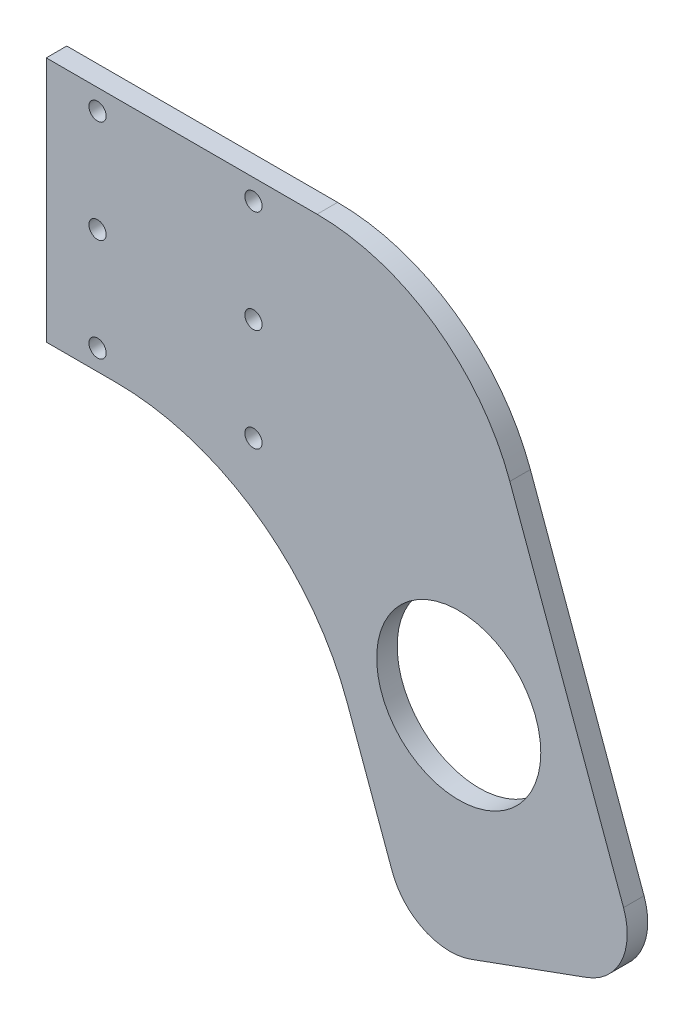
ISO-10303-21;
HEADER;
FILE_DESCRIPTION(('STEP AP214'),'2;1');
FILE_NAME('part.step','',(''),(''),'','','');
FILE_SCHEMA(('AUTOMOTIVE_DESIGN { 1 0 10303 214 1 1 1 1 }'));
ENDSEC;
DATA;
#1=APPLICATION_CONTEXT('core data for automotive mechanical design processes');
#2=APPLICATION_PROTOCOL_DEFINITION('international standard','automotive_design',2000,#1);
#3=PRODUCT_CONTEXT('',#1,'mechanical');
#4=PRODUCT('Part','Part','',(#3));
#5=PRODUCT_RELATED_PRODUCT_CATEGORY('part','',(#4));
#6=PRODUCT_DEFINITION_FORMATION('','',#4);
#7=PRODUCT_DEFINITION_CONTEXT('part definition',#1,'design');
#8=PRODUCT_DEFINITION('design','',#6,#7);
#9=PRODUCT_DEFINITION_SHAPE('','',#8);
#10=(LENGTH_UNIT() NAMED_UNIT(*) SI_UNIT(.MILLI.,.METRE.));
#11=(NAMED_UNIT(*) PLANE_ANGLE_UNIT() SI_UNIT($,.RADIAN.));
#12=(NAMED_UNIT(*) SI_UNIT($,.STERADIAN.) SOLID_ANGLE_UNIT());
#13=UNCERTAINTY_MEASURE_WITH_UNIT(LENGTH_MEASURE(1.E-05),#10,'distance_accuracy_value','');
#14=(GEOMETRIC_REPRESENTATION_CONTEXT(3) GLOBAL_UNCERTAINTY_ASSIGNED_CONTEXT((#13)) GLOBAL_UNIT_ASSIGNED_CONTEXT((#10,
#11,#12)) REPRESENTATION_CONTEXT('',''));
#15=CARTESIAN_POINT('',(0.,0.,0.));
#16=DIRECTION('',(0.,0.,1.));
#17=DIRECTION('',(1.,0.,0.));
#18=AXIS2_PLACEMENT_3D('',#15,#16,#17);
#19=CARTESIAN_POINT('',(0.,0.,5.));
#20=DIRECTION('',(0.,0.,1.));
#21=DIRECTION('',(1.,0.,0.));
#22=AXIS2_PLACEMENT_3D('',#19,#20,#21);
#23=PLANE('',#22);
#24=CARTESIAN_POINT('',(-29.5,56.5646236357601,5.));
#25=DIRECTION('',(0.,0.,1.));
#26=DIRECTION('',(1.,0.,0.));
#27=AXIS2_PLACEMENT_3D('',#24,#25,#26);
#28=CIRCLE('',#27,2.1);
#29=CARTESIAN_POINT('',(-27.4,56.5646236357601,5.));
#30=VERTEX_POINT('',#29);
#31=EDGE_CURVE('E296',#30,#30,#28,.T.);
#32=ORIENTED_EDGE('',*,*,#31,.F.);
#33=EDGE_LOOP('',(#32));
#34=FACE_BOUND('',#33,.T.);
#35=CARTESIAN_POINT('',(-67.5,31.5646236357601,5.));
#36=DIRECTION('',(0.,0.,1.));
#37=DIRECTION('',(1.,0.,0.));
#38=AXIS2_PLACEMENT_3D('',#35,#36,#37);
#39=CIRCLE('',#38,2.1);
#40=CARTESIAN_POINT('',(-65.4,31.5646236357601,5.));
#41=VERTEX_POINT('',#40);
#42=EDGE_CURVE('E280',#41,#41,#39,.T.);
#43=ORIENTED_EDGE('',*,*,#42,.F.);
#44=EDGE_LOOP('',(#43));
#45=FACE_BOUND('',#44,.T.);
#46=CARTESIAN_POINT('',(-67.5,81.5646236357601,5.));
#47=DIRECTION('',(0.,0.,1.));
#48=DIRECTION('',(1.,0.,0.));
#49=AXIS2_PLACEMENT_3D('',#46,#47,#48);
#50=CIRCLE('',#49,2.1);
#51=CARTESIAN_POINT('',(-65.4,81.5646236357601,5.));
#52=VERTEX_POINT('',#51);
#53=EDGE_CURVE('E264',#52,#52,#50,.T.);
#54=ORIENTED_EDGE('',*,*,#53,.F.);
#55=EDGE_LOOP('',(#54));
#56=FACE_BOUND('',#55,.T.);
#57=DIRECTION('',(0.939692620785907,0.342020143325674,0.));
#58=VECTOR('',#57,1.);
#59=CARTESIAN_POINT('',(9.4314371422469,-57.0621689504598,5.));
#60=LINE('',#59,#58);
#61=CARTESIAN_POINT('',(23.5268264540355,-51.9318668005747,5.));
#62=VERTEX_POINT('',#61);
#63=CARTESIAN_POINT('',(51.7176050776127,-41.6712625008045,5.));
#64=VERTEX_POINT('',#63);
#65=EDGE_CURVE('E225',#62,#64,#60,.T.);
#66=ORIENTED_EDGE('',*,*,#65,.T.);
#67=CARTESIAN_POINT('',(46.5873029277276,-27.5758731890159,5.));
#68=DIRECTION('',(0.,0.,1.));
#69=DIRECTION('',(1.,0.,0.));
#70=AXIS2_PLACEMENT_3D('',#67,#68,#69);
#71=CIRCLE('',#70,15.);
#72=CARTESIAN_POINT('',(60.6826922395162,-22.4455710391308,5.));
#73=VERTEX_POINT('',#72);
#74=EDGE_CURVE('E54',#64,#73,#71,.T.);
#75=ORIENTED_EDGE('',*,*,#74,.T.);
#76=DIRECTION('',(-0.342020143325674,0.939692620785907,0.));
#77=VECTOR('',#76,1.);
#78=CARTESIAN_POINT('',(21.0062261462912,86.5646236357601,5.));
#79=LINE('',#78,#77);
#80=CARTESIAN_POINT('',(32.9804802751012,53.6656308020438,5.));
#81=VERTEX_POINT('',#80);
#82=EDGE_CURVE('E137',#73,#81,#79,.T.);
#83=ORIENTED_EDGE('',*,*,#82,.T.);
#84=CARTESIAN_POINT('',(-14.0041507641941,36.5646236357601,5.));
#85=DIRECTION('',(0.,0.,1.));
#86=DIRECTION('',(1.,0.,0.));
#87=AXIS2_PLACEMENT_3D('',#84,#85,#86);
#88=CIRCLE('',#87,50.);
#89=CARTESIAN_POINT('',(-14.0041507641941,86.5646236357601,5.));
#90=VERTEX_POINT('',#89);
#91=EDGE_CURVE('E132',#81,#90,#88,.T.);
#92=ORIENTED_EDGE('',*,*,#91,.T.);
#93=DIRECTION('',(-1.,0.,0.));
#94=VECTOR('',#93,1.);
#95=CARTESIAN_POINT('',(0.,86.5646236357601,5.));
#96=LINE('',#95,#94);
#97=CARTESIAN_POINT('',(-80.,86.5646236357601,5.));
#98=VERTEX_POINT('',#97);
#99=EDGE_CURVE('E124',#90,#98,#96,.T.);
#100=ORIENTED_EDGE('',*,*,#99,.T.);
#101=DIRECTION('',(0.,-1.,0.));
#102=VECTOR('',#101,1.);
#103=CARTESIAN_POINT('',(-80.,26.5646236357601,5.));
#104=LINE('',#103,#102);
#105=CARTESIAN_POINT('',(-80.,26.5646236357601,5.));
#106=VERTEX_POINT('',#105);
#107=EDGE_CURVE('E129',#98,#106,#104,.T.);
#108=ORIENTED_EDGE('',*,*,#107,.T.);
#109=DIRECTION('',(1.,0.,0.));
#110=VECTOR('',#109,1.);
#111=CARTESIAN_POINT('',(-80.,26.5646236357601,5.));
#112=LINE('',#111,#110);
#113=CARTESIAN_POINT('',(-63.0186784388736,26.5646236357601,5.));
#114=VERTEX_POINT('',#113);
#115=EDGE_CURVE('E177',#106,#114,#112,.T.);
#116=ORIENTED_EDGE('',*,*,#115,.T.);
#117=CARTESIAN_POINT('',(-63.0186784388735,-33.4353763642399,5.));
#118=DIRECTION('',(0.,0.,1.));
#119=DIRECTION('',(1.,0.,0.));
#120=AXIS2_PLACEMENT_3D('',#117,#118,#119);
#121=CIRCLE('',#120,60.);
#122=CARTESIAN_POINT('',(-6.63712119171913,-12.9141677646995,5.));
#123=VERTEX_POINT('',#122);
#124=EDGE_CURVE('E201',#114,#123,#121,.F.);
#125=ORIENTED_EDGE('',*,*,#124,.T.);
#126=DIRECTION('',(0.342020143325674,-0.939692620785907,0.));
#127=VECTOR('',#126,1.);
#128=CARTESIAN_POINT('',(-21.0062261462912,26.5646236357601,5.));
#129=LINE('',#128,#127);
#130=CARTESIAN_POINT('',(4.30113499236179,-42.9667796386713,5.));
#131=VERTEX_POINT('',#130);
#132=EDGE_CURVE('E245',#123,#131,#129,.T.);
#133=ORIENTED_EDGE('',*,*,#132,.T.);
#134=CARTESIAN_POINT('',(18.3965243041504,-37.8364774887861,5.));
#135=DIRECTION('',(0.,0.,1.));
#136=DIRECTION('',(1.,0.,0.));
#137=AXIS2_PLACEMENT_3D('',#134,#135,#136);
#138=CIRCLE('',#137,15.);
#139=EDGE_CURVE('E220',#131,#62,#138,.T.);
#140=ORIENTED_EDGE('',*,*,#139,.T.);
#141=EDGE_LOOP('',(#66,#75,#83,#92,#100,#108,#116,#125,#133,#140));
#142=FACE_BOUND('',#141,.T.);
#143=CARTESIAN_POINT('',(20.5212085995404,0.183066388605708,5.));
#144=DIRECTION('',(0.,0.,1.));
#145=DIRECTION('',(1.,0.,0.));
#146=AXIS2_PLACEMENT_3D('',#143,#144,#145);
#147=CIRCLE('',#146,20.);
#148=CARTESIAN_POINT('',(40.5212085995404,0.183066388605708,5.));
#149=VERTEX_POINT('',#148);
#150=EDGE_CURVE('E164',#149,#149,#147,.T.);
#151=ORIENTED_EDGE('',*,*,#150,.F.);
#152=EDGE_LOOP('',(#151));
#153=FACE_BOUND('',#152,.T.);
#154=CARTESIAN_POINT('',(-67.5,56.5646236357601,5.));
#155=DIRECTION('',(0.,0.,1.));
#156=DIRECTION('',(1.,0.,0.));
#157=AXIS2_PLACEMENT_3D('',#154,#155,#156);
#158=CIRCLE('',#157,2.1);
#159=CARTESIAN_POINT('',(-65.4,56.5646236357601,5.));
#160=VERTEX_POINT('',#159);
#161=EDGE_CURVE('E272',#160,#160,#158,.T.);
#162=ORIENTED_EDGE('',*,*,#161,.F.);
#163=EDGE_LOOP('',(#162));
#164=FACE_BOUND('',#163,.T.);
#165=CARTESIAN_POINT('',(-29.5,81.5646236357601,5.));
#166=DIRECTION('',(0.,0.,1.));
#167=DIRECTION('',(1.,0.,0.));
#168=AXIS2_PLACEMENT_3D('',#165,#166,#167);
#169=CIRCLE('',#168,2.1);
#170=CARTESIAN_POINT('',(-27.4,81.5646236357601,5.));
#171=VERTEX_POINT('',#170);
#172=EDGE_CURVE('E288',#171,#171,#169,.T.);
#173=ORIENTED_EDGE('',*,*,#172,.F.);
#174=EDGE_LOOP('',(#173));
#175=FACE_BOUND('',#174,.T.);
#176=CARTESIAN_POINT('',(-29.5,31.5646236357601,5.));
#177=DIRECTION('',(0.,0.,1.));
#178=DIRECTION('',(1.,0.,0.));
#179=AXIS2_PLACEMENT_3D('',#176,#177,#178);
#180=CIRCLE('',#179,2.1);
#181=CARTESIAN_POINT('',(-27.4,31.5646236357601,5.));
#182=VERTEX_POINT('',#181);
#183=EDGE_CURVE('E304',#182,#182,#180,.T.);
#184=ORIENTED_EDGE('',*,*,#183,.F.);
#185=EDGE_LOOP('',(#184));
#186=FACE_BOUND('',#185,.T.);
#187=ADVANCED_FACE('F45',(#34,#45,#56,#142,#153,#164,#175,#186),#23,.T.);
#188=CARTESIAN_POINT('',(0.,0.,0.));
#189=DIRECTION('',(0.,0.,1.));
#190=DIRECTION('',(1.,0.,0.));
#191=AXIS2_PLACEMENT_3D('',#188,#189,#190);
#192=PLANE('',#191);
#193=DIRECTION('',(-0.342020143325674,0.939692620785907,0.));
#194=VECTOR('',#193,1.);
#195=CARTESIAN_POINT('',(21.0062261462912,86.5646236357601,0.));
#196=LINE('',#195,#194);
#197=CARTESIAN_POINT('',(60.6826922395162,-22.4455710391308,0.));
#198=VERTEX_POINT('',#197);
#199=CARTESIAN_POINT('',(32.9804802751012,53.6656308020438,0.));
#200=VERTEX_POINT('',#199);
#201=EDGE_CURVE('E170',#198,#200,#196,.T.);
#202=ORIENTED_EDGE('',*,*,#201,.F.);
#203=CARTESIAN_POINT('',(46.5873029277276,-27.5758731890159,0.));
#204=DIRECTION('',(0.,0.,1.));
#205=DIRECTION('',(1.,0.,0.));
#206=AXIS2_PLACEMENT_3D('',#203,#204,#205);
#207=CIRCLE('',#206,15.);
#208=CARTESIAN_POINT('',(51.7176050776127,-41.6712625008045,0.));
#209=VERTEX_POINT('',#208);
#210=EDGE_CURVE('E211',#198,#209,#207,.F.);
#211=ORIENTED_EDGE('',*,*,#210,.T.);
#212=DIRECTION('',(0.939692620785907,0.342020143325674,0.));
#213=VECTOR('',#212,1.);
#214=CARTESIAN_POINT('',(9.4314371422469,-57.0621689504598,0.));
#215=LINE('',#214,#213);
#216=CARTESIAN_POINT('',(23.5268264540355,-51.9318668005747,0.));
#217=VERTEX_POINT('',#216);
#218=EDGE_CURVE('E167',#217,#209,#215,.T.);
#219=ORIENTED_EDGE('',*,*,#218,.F.);
#220=CARTESIAN_POINT('',(18.3965243041504,-37.8364774887861,0.));
#221=DIRECTION('',(0.,0.,1.));
#222=DIRECTION('',(1.,0.,0.));
#223=AXIS2_PLACEMENT_3D('',#220,#221,#222);
#224=CIRCLE('',#223,15.);
#225=CARTESIAN_POINT('',(4.30113499236179,-42.9667796386713,0.));
#226=VERTEX_POINT('',#225);
#227=EDGE_CURVE('E208',#217,#226,#224,.F.);
#228=ORIENTED_EDGE('',*,*,#227,.T.);
#229=DIRECTION('',(0.342020143325674,-0.939692620785907,0.));
#230=VECTOR('',#229,1.);
#231=CARTESIAN_POINT('',(-21.0062261462912,26.5646236357601,0.));
#232=LINE('',#231,#230);
#233=CARTESIAN_POINT('',(-6.63712119171913,-12.9141677646995,0.));
#234=VERTEX_POINT('',#233);
#235=EDGE_CURVE('E163',#234,#226,#232,.T.);
#236=ORIENTED_EDGE('',*,*,#235,.F.);
#237=CARTESIAN_POINT('',(-63.0186784388735,-33.4353763642399,0.));
#238=DIRECTION('',(0.,0.,1.));
#239=DIRECTION('',(1.,0.,0.));
#240=AXIS2_PLACEMENT_3D('',#237,#238,#239);
#241=CIRCLE('',#240,60.);
#242=CARTESIAN_POINT('',(-63.0186784388736,26.5646236357601,0.));
#243=VERTEX_POINT('',#242);
#244=EDGE_CURVE('E198',#234,#243,#241,.T.);
#245=ORIENTED_EDGE('',*,*,#244,.T.);
#246=DIRECTION('',(1.,0.,0.));
#247=VECTOR('',#246,1.);
#248=CARTESIAN_POINT('',(-80.,26.5646236357601,0.));
#249=LINE('',#248,#247);
#250=CARTESIAN_POINT('',(-80.,26.5646236357601,0.));
#251=VERTEX_POINT('',#250);
#252=EDGE_CURVE('E159',#251,#243,#249,.T.);
#253=ORIENTED_EDGE('',*,*,#252,.F.);
#254=DIRECTION('',(0.,-1.,0.));
#255=VECTOR('',#254,1.);
#256=CARTESIAN_POINT('',(-80.,26.5646236357601,0.));
#257=LINE('',#256,#255);
#258=CARTESIAN_POINT('',(-80.,86.5646236357601,0.));
#259=VERTEX_POINT('',#258);
#260=EDGE_CURVE('E175',#259,#251,#257,.T.);
#261=ORIENTED_EDGE('',*,*,#260,.F.);
#262=DIRECTION('',(-1.,0.,0.));
#263=VECTOR('',#262,1.);
#264=CARTESIAN_POINT('',(-80.,86.5646236357601,0.));
#265=LINE('',#264,#263);
#266=CARTESIAN_POINT('',(-14.0041507641941,86.5646236357601,0.));
#267=VERTEX_POINT('',#266);
#268=EDGE_CURVE('E143',#267,#259,#265,.T.);
#269=ORIENTED_EDGE('',*,*,#268,.F.);
#270=CARTESIAN_POINT('',(-14.0041507641941,36.5646236357601,0.));
#271=DIRECTION('',(0.,0.,1.));
#272=DIRECTION('',(1.,0.,0.));
#273=AXIS2_PLACEMENT_3D('',#270,#271,#272);
#274=CIRCLE('',#273,50.);
#275=EDGE_CURVE('E181',#267,#200,#274,.F.);
#276=ORIENTED_EDGE('',*,*,#275,.T.);
#277=EDGE_LOOP('',(#202,#211,#219,#228,#236,#245,#253,#261,#269,#276));
#278=FACE_BOUND('',#277,.T.);
#279=CARTESIAN_POINT('',(20.5212085995404,0.183066388605708,0.));
#280=DIRECTION('',(0.,0.,1.));
#281=DIRECTION('',(1.,0.,0.));
#282=AXIS2_PLACEMENT_3D('',#279,#280,#281);
#283=CIRCLE('',#282,20.);
#284=CARTESIAN_POINT('',(40.5212085995404,0.183066388605708,0.));
#285=VERTEX_POINT('',#284);
#286=EDGE_CURVE('E258',#285,#285,#283,.T.);
#287=ORIENTED_EDGE('',*,*,#286,.T.);
#288=EDGE_LOOP('',(#287));
#289=FACE_BOUND('',#288,.T.);
#290=CARTESIAN_POINT('',(-67.5,81.5646236357601,0.));
#291=DIRECTION('',(0.,0.,1.));
#292=DIRECTION('',(1.,0.,0.));
#293=AXIS2_PLACEMENT_3D('',#290,#291,#292);
#294=CIRCLE('',#293,2.1);
#295=CARTESIAN_POINT('',(-65.4,81.5646236357601,0.));
#296=VERTEX_POINT('',#295);
#297=EDGE_CURVE('E268',#296,#296,#294,.T.);
#298=ORIENTED_EDGE('',*,*,#297,.T.);
#299=EDGE_LOOP('',(#298));
#300=FACE_BOUND('',#299,.T.);
#301=CARTESIAN_POINT('',(-67.5,56.5646236357601,0.));
#302=DIRECTION('',(0.,0.,1.));
#303=DIRECTION('',(1.,0.,0.));
#304=AXIS2_PLACEMENT_3D('',#301,#302,#303);
#305=CIRCLE('',#304,2.1);
#306=CARTESIAN_POINT('',(-65.4,56.5646236357601,0.));
#307=VERTEX_POINT('',#306);
#308=EDGE_CURVE('E276',#307,#307,#305,.T.);
#309=ORIENTED_EDGE('',*,*,#308,.T.);
#310=EDGE_LOOP('',(#309));
#311=FACE_BOUND('',#310,.T.);
#312=CARTESIAN_POINT('',(-67.5,31.5646236357601,0.));
#313=DIRECTION('',(0.,0.,1.));
#314=DIRECTION('',(1.,0.,0.));
#315=AXIS2_PLACEMENT_3D('',#312,#313,#314);
#316=CIRCLE('',#315,2.1);
#317=CARTESIAN_POINT('',(-65.4,31.5646236357601,0.));
#318=VERTEX_POINT('',#317);
#319=EDGE_CURVE('E284',#318,#318,#316,.T.);
#320=ORIENTED_EDGE('',*,*,#319,.T.);
#321=EDGE_LOOP('',(#320));
#322=FACE_BOUND('',#321,.T.);
#323=CARTESIAN_POINT('',(-29.5,81.5646236357601,0.));
#324=DIRECTION('',(0.,0.,1.));
#325=DIRECTION('',(1.,0.,0.));
#326=AXIS2_PLACEMENT_3D('',#323,#324,#325);
#327=CIRCLE('',#326,2.1);
#328=CARTESIAN_POINT('',(-27.4,81.5646236357601,0.));
#329=VERTEX_POINT('',#328);
#330=EDGE_CURVE('E292',#329,#329,#327,.T.);
#331=ORIENTED_EDGE('',*,*,#330,.T.);
#332=EDGE_LOOP('',(#331));
#333=FACE_BOUND('',#332,.T.);
#334=CARTESIAN_POINT('',(-29.5,56.5646236357601,0.));
#335=DIRECTION('',(0.,0.,1.));
#336=DIRECTION('',(1.,0.,0.));
#337=AXIS2_PLACEMENT_3D('',#334,#335,#336);
#338=CIRCLE('',#337,2.1);
#339=CARTESIAN_POINT('',(-27.4,56.5646236357601,0.));
#340=VERTEX_POINT('',#339);
#341=EDGE_CURVE('E300',#340,#340,#338,.T.);
#342=ORIENTED_EDGE('',*,*,#341,.T.);
#343=EDGE_LOOP('',(#342));
#344=FACE_BOUND('',#343,.T.);
#345=CARTESIAN_POINT('',(-29.5,31.5646236357601,0.));
#346=DIRECTION('',(0.,0.,1.));
#347=DIRECTION('',(1.,0.,0.));
#348=AXIS2_PLACEMENT_3D('',#345,#346,#347);
#349=CIRCLE('',#348,2.1);
#350=CARTESIAN_POINT('',(-27.4,31.5646236357601,0.));
#351=VERTEX_POINT('',#350);
#352=EDGE_CURVE('E308',#351,#351,#349,.T.);
#353=ORIENTED_EDGE('',*,*,#352,.T.);
#354=EDGE_LOOP('',(#353));
#355=FACE_BOUND('',#354,.T.);
#356=ADVANCED_FACE('F236',(#278,#289,#300,#311,#322,#333,#344,#355),#192,.F.);
#357=CARTESIAN_POINT('',(-80.,26.5646236357601,5.));
#358=DIRECTION('',(0.,1.,0.));
#359=DIRECTION('',(-1.,0.,0.));
#360=AXIS2_PLACEMENT_3D('',#357,#358,#359);
#361=PLANE('',#360);
#362=ORIENTED_EDGE('',*,*,#252,.T.);
#363=DIRECTION('',(0.,0.,-1.));
#364=VECTOR('',#363,1.);
#365=CARTESIAN_POINT('',(-63.0186784388736,26.5646236357601,5.));
#366=LINE('',#365,#364);
#367=EDGE_CURVE('E195',#243,#114,#366,.F.);
#368=ORIENTED_EDGE('',*,*,#367,.T.);
#369=ORIENTED_EDGE('',*,*,#115,.F.);
#370=DIRECTION('',(0.,0.,-1.));
#371=VECTOR('',#370,1.);
#372=CARTESIAN_POINT('',(-80.,26.5646236357601,5.));
#373=LINE('',#372,#371);
#374=EDGE_CURVE('E148',#106,#251,#373,.T.);
#375=ORIENTED_EDGE('',*,*,#374,.T.);
#376=EDGE_LOOP('',(#362,#368,#369,#375));
#377=FACE_BOUND('',#376,.T.);
#378=ADVANCED_FACE('F252',(#377),#361,.F.);
#379=CARTESIAN_POINT('',(-21.0062261462912,26.5646236357601,5.));
#380=DIRECTION('',(0.939692620785907,0.342020143325674,0.));
#381=DIRECTION('',(-0.342020143325674,0.939692620785907,0.));
#382=AXIS2_PLACEMENT_3D('',#379,#380,#381);
#383=PLANE('',#382);
#384=ORIENTED_EDGE('',*,*,#235,.T.);
#385=DIRECTION('',(0.,0.,-1.));
#386=VECTOR('',#385,1.);
#387=CARTESIAN_POINT('',(4.30113499236179,-42.9667796386713,5.));
#388=LINE('',#387,#386);
#389=EDGE_CURVE('E11',#226,#131,#388,.F.);
#390=ORIENTED_EDGE('',*,*,#389,.T.);
#391=ORIENTED_EDGE('',*,*,#132,.F.);
#392=DIRECTION('',(0.,0.,-1.));
#393=VECTOR('',#392,1.);
#394=CARTESIAN_POINT('',(-6.63712119171913,-12.9141677646995,0.));
#395=LINE('',#394,#393);
#396=EDGE_CURVE('E191',#123,#234,#395,.T.);
#397=ORIENTED_EDGE('',*,*,#396,.T.);
#398=EDGE_LOOP('',(#384,#390,#391,#397));
#399=FACE_BOUND('',#398,.T.);
#400=ADVANCED_FACE('F243',(#399),#383,.F.);
#401=CARTESIAN_POINT('',(9.4314371422469,-57.0621689504598,5.));
#402=DIRECTION('',(-0.342020143325674,0.939692620785907,0.));
#403=DIRECTION('',(-0.939692620785907,-0.342020143325674,0.));
#404=AXIS2_PLACEMENT_3D('',#401,#402,#403);
#405=PLANE('',#404);
#406=ORIENTED_EDGE('',*,*,#218,.T.);
#407=DIRECTION('',(0.,0.,-1.));
#408=VECTOR('',#407,1.);
#409=CARTESIAN_POINT('',(51.7176050776127,-41.6712625008045,5.));
#410=LINE('',#409,#408);
#411=EDGE_CURVE('E67',#209,#64,#410,.F.);
#412=ORIENTED_EDGE('',*,*,#411,.T.);
#413=ORIENTED_EDGE('',*,*,#65,.F.);
#414=DIRECTION('',(0.,0.,-1.));
#415=VECTOR('',#414,1.);
#416=CARTESIAN_POINT('',(23.5268264540355,-51.9318668005747,5.));
#417=LINE('',#416,#415);
#418=EDGE_CURVE('E214',#62,#217,#417,.T.);
#419=ORIENTED_EDGE('',*,*,#418,.T.);
#420=EDGE_LOOP('',(#406,#412,#413,#419));
#421=FACE_BOUND('',#420,.T.);
#422=ADVANCED_FACE('F238',(#421),#405,.F.);
#423=CARTESIAN_POINT('',(21.0062261462912,86.5646236357601,5.));
#424=DIRECTION('',(-0.939692620785907,-0.342020143325674,0.));
#425=DIRECTION('',(0.342020143325674,-0.939692620785907,0.));
#426=AXIS2_PLACEMENT_3D('',#423,#424,#425);
#427=PLANE('',#426);
#428=ORIENTED_EDGE('',*,*,#82,.F.);
#429=DIRECTION('',(0.,0.,-1.));
#430=VECTOR('',#429,1.);
#431=CARTESIAN_POINT('',(60.6826922395162,-22.4455710391308,5.));
#432=LINE('',#431,#430);
#433=EDGE_CURVE('E204',#73,#198,#432,.T.);
#434=ORIENTED_EDGE('',*,*,#433,.T.);
#435=ORIENTED_EDGE('',*,*,#201,.T.);
#436=DIRECTION('',(0.,0.,-1.));
#437=VECTOR('',#436,1.);
#438=CARTESIAN_POINT('',(32.9804802751012,53.6656308020438,5.));
#439=LINE('',#438,#437);
#440=EDGE_CURVE('E185',#200,#81,#439,.F.);
#441=ORIENTED_EDGE('',*,*,#440,.T.);
#442=EDGE_LOOP('',(#428,#434,#435,#441));
#443=FACE_BOUND('',#442,.T.);
#444=ADVANCED_FACE('F229',(#443),#427,.F.);
#445=CARTESIAN_POINT('',(-80.,86.5646236357601,5.));
#446=DIRECTION('',(0.,-1.,0.));
#447=DIRECTION('',(0.,0.,-1.));
#448=AXIS2_PLACEMENT_3D('',#445,#446,#447);
#449=PLANE('',#448);
#450=ORIENTED_EDGE('',*,*,#99,.F.);
#451=DIRECTION('',(0.,0.,-1.));
#452=VECTOR('',#451,1.);
#453=CARTESIAN_POINT('',(-14.0041507641941,86.5646236357601,5.));
#454=LINE('',#453,#452);
#455=EDGE_CURVE('E147',#90,#267,#454,.T.);
#456=ORIENTED_EDGE('',*,*,#455,.T.);
#457=ORIENTED_EDGE('',*,*,#268,.T.);
#458=DIRECTION('',(0.,0.,-1.));
#459=VECTOR('',#458,1.);
#460=CARTESIAN_POINT('',(-80.,86.5646236357601,5.));
#461=LINE('',#460,#459);
#462=EDGE_CURVE('E140',#98,#259,#461,.T.);
#463=ORIENTED_EDGE('',*,*,#462,.F.);
#464=EDGE_LOOP('',(#450,#456,#457,#463));
#465=FACE_BOUND('',#464,.T.);
#466=ADVANCED_FACE('F141',(#465),#449,.F.);
#467=CARTESIAN_POINT('',(-80.,26.5646236357601,5.));
#468=DIRECTION('',(1.,0.,0.));
#469=DIRECTION('',(0.,1.,0.));
#470=AXIS2_PLACEMENT_3D('',#467,#468,#469);
#471=PLANE('',#470);
#472=ORIENTED_EDGE('',*,*,#260,.T.);
#473=ORIENTED_EDGE('',*,*,#374,.F.);
#474=ORIENTED_EDGE('',*,*,#107,.F.);
#475=ORIENTED_EDGE('',*,*,#462,.T.);
#476=EDGE_LOOP('',(#472,#473,#474,#475));
#477=FACE_BOUND('',#476,.T.);
#478=ADVANCED_FACE('F150',(#477),#471,.F.);
#479=CARTESIAN_POINT('',(20.5212085995404,0.183066388605708,5.));
#480=DIRECTION('',(0.,0.,-1.));
#481=DIRECTION('',(-1.,0.,0.));
#482=AXIS2_PLACEMENT_3D('',#479,#480,#481);
#483=CYLINDRICAL_SURFACE('',#482,20.);
#484=ORIENTED_EDGE('',*,*,#150,.T.);
#485=EDGE_LOOP('',(#484));
#486=FACE_BOUND('',#485,.T.);
#487=ORIENTED_EDGE('',*,*,#286,.F.);
#488=EDGE_LOOP('',(#487));
#489=FACE_BOUND('',#488,.T.);
#490=ADVANCED_FACE('F330',(#486,#489),#483,.F.);
#491=CARTESIAN_POINT('',(-67.5,81.5646236357601,5.));
#492=DIRECTION('',(0.,0.,-1.));
#493=DIRECTION('',(-1.,0.,0.));
#494=AXIS2_PLACEMENT_3D('',#491,#492,#493);
#495=CYLINDRICAL_SURFACE('',#494,2.1);
#496=ORIENTED_EDGE('',*,*,#53,.T.);
#497=EDGE_LOOP('',(#496));
#498=FACE_BOUND('',#497,.T.);
#499=ORIENTED_EDGE('',*,*,#297,.F.);
#500=EDGE_LOOP('',(#499));
#501=FACE_BOUND('',#500,.T.);
#502=ADVANCED_FACE('F420',(#498,#501),#495,.F.);
#503=CARTESIAN_POINT('',(-67.5,56.5646236357601,5.));
#504=DIRECTION('',(0.,0.,-1.));
#505=DIRECTION('',(-1.,0.,0.));
#506=AXIS2_PLACEMENT_3D('',#503,#504,#505);
#507=CYLINDRICAL_SURFACE('',#506,2.1);
#508=ORIENTED_EDGE('',*,*,#161,.T.);
#509=EDGE_LOOP('',(#508));
#510=FACE_BOUND('',#509,.T.);
#511=ORIENTED_EDGE('',*,*,#308,.F.);
#512=EDGE_LOOP('',(#511));
#513=FACE_BOUND('',#512,.T.);
#514=ADVANCED_FACE('F410',(#510,#513),#507,.F.);
#515=CARTESIAN_POINT('',(-67.5,31.5646236357601,5.));
#516=DIRECTION('',(0.,0.,-1.));
#517=DIRECTION('',(-1.,0.,0.));
#518=AXIS2_PLACEMENT_3D('',#515,#516,#517);
#519=CYLINDRICAL_SURFACE('',#518,2.1);
#520=ORIENTED_EDGE('',*,*,#42,.T.);
#521=EDGE_LOOP('',(#520));
#522=FACE_BOUND('',#521,.T.);
#523=ORIENTED_EDGE('',*,*,#319,.F.);
#524=EDGE_LOOP('',(#523));
#525=FACE_BOUND('',#524,.T.);
#526=ADVANCED_FACE('F400',(#522,#525),#519,.F.);
#527=CARTESIAN_POINT('',(-29.5,81.5646236357601,5.));
#528=DIRECTION('',(0.,0.,-1.));
#529=DIRECTION('',(-1.,0.,0.));
#530=AXIS2_PLACEMENT_3D('',#527,#528,#529);
#531=CYLINDRICAL_SURFACE('',#530,2.1);
#532=ORIENTED_EDGE('',*,*,#172,.T.);
#533=EDGE_LOOP('',(#532));
#534=FACE_BOUND('',#533,.T.);
#535=ORIENTED_EDGE('',*,*,#330,.F.);
#536=EDGE_LOOP('',(#535));
#537=FACE_BOUND('',#536,.T.);
#538=ADVANCED_FACE('F390',(#534,#537),#531,.F.);
#539=CARTESIAN_POINT('',(-29.5,56.5646236357601,5.));
#540=DIRECTION('',(0.,0.,-1.));
#541=DIRECTION('',(-1.,0.,0.));
#542=AXIS2_PLACEMENT_3D('',#539,#540,#541);
#543=CYLINDRICAL_SURFACE('',#542,2.1);
#544=ORIENTED_EDGE('',*,*,#31,.T.);
#545=EDGE_LOOP('',(#544));
#546=FACE_BOUND('',#545,.T.);
#547=ORIENTED_EDGE('',*,*,#341,.F.);
#548=EDGE_LOOP('',(#547));
#549=FACE_BOUND('',#548,.T.);
#550=ADVANCED_FACE('F381',(#546,#549),#543,.F.);
#551=CARTESIAN_POINT('',(-29.5,31.5646236357601,5.));
#552=DIRECTION('',(0.,0.,-1.));
#553=DIRECTION('',(-1.,0.,0.));
#554=AXIS2_PLACEMENT_3D('',#551,#552,#553);
#555=CYLINDRICAL_SURFACE('',#554,2.1);
#556=ORIENTED_EDGE('',*,*,#183,.T.);
#557=EDGE_LOOP('',(#556));
#558=FACE_BOUND('',#557,.T.);
#559=ORIENTED_EDGE('',*,*,#352,.F.);
#560=EDGE_LOOP('',(#559));
#561=FACE_BOUND('',#560,.T.);
#562=ADVANCED_FACE('F316',(#558,#561),#555,.F.);
#563=CARTESIAN_POINT('',(-14.0041507641941,36.5646236357601,5.));
#564=DIRECTION('',(0.,0.,-1.));
#565=DIRECTION('',(-1.,0.,0.));
#566=AXIS2_PLACEMENT_3D('',#563,#564,#565);
#567=CYLINDRICAL_SURFACE('',#566,50.);
#568=ORIENTED_EDGE('',*,*,#91,.F.);
#569=ORIENTED_EDGE('',*,*,#440,.F.);
#570=ORIENTED_EDGE('',*,*,#275,.F.);
#571=ORIENTED_EDGE('',*,*,#455,.F.);
#572=EDGE_LOOP('',(#568,#569,#570,#571));
#573=FACE_BOUND('',#572,.T.);
#574=ADVANCED_FACE('F345',(#573),#567,.T.);
#575=CARTESIAN_POINT('',(-63.0186784388735,-33.4353763642399,5.));
#576=DIRECTION('',(0.,0.,1.));
#577=DIRECTION('',(1.,0.,0.));
#578=AXIS2_PLACEMENT_3D('',#575,#576,#577);
#579=CYLINDRICAL_SURFACE('',#578,60.);
#580=ORIENTED_EDGE('',*,*,#124,.F.);
#581=ORIENTED_EDGE('',*,*,#367,.F.);
#582=ORIENTED_EDGE('',*,*,#244,.F.);
#583=ORIENTED_EDGE('',*,*,#396,.F.);
#584=EDGE_LOOP('',(#580,#581,#582,#583));
#585=FACE_BOUND('',#584,.T.);
#586=ADVANCED_FACE('F248',(#585),#579,.F.);
#587=CARTESIAN_POINT('',(46.5873029277276,-27.5758731890159,5.));
#588=DIRECTION('',(0.,0.,-1.));
#589=DIRECTION('',(-1.,0.,0.));
#590=AXIS2_PLACEMENT_3D('',#587,#588,#589);
#591=CYLINDRICAL_SURFACE('',#590,15.);
#592=ORIENTED_EDGE('',*,*,#74,.F.);
#593=ORIENTED_EDGE('',*,*,#411,.F.);
#594=ORIENTED_EDGE('',*,*,#210,.F.);
#595=ORIENTED_EDGE('',*,*,#433,.F.);
#596=EDGE_LOOP('',(#592,#593,#594,#595));
#597=FACE_BOUND('',#596,.T.);
#598=ADVANCED_FACE('F233',(#597),#591,.T.);
#599=CARTESIAN_POINT('',(18.3965243041504,-37.8364774887861,5.));
#600=DIRECTION('',(0.,0.,-1.));
#601=DIRECTION('',(-1.,0.,0.));
#602=AXIS2_PLACEMENT_3D('',#599,#600,#601);
#603=CYLINDRICAL_SURFACE('',#602,15.);
#604=ORIENTED_EDGE('',*,*,#139,.F.);
#605=ORIENTED_EDGE('',*,*,#389,.F.);
#606=ORIENTED_EDGE('',*,*,#227,.F.);
#607=ORIENTED_EDGE('',*,*,#418,.F.);
#608=EDGE_LOOP('',(#604,#605,#606,#607));
#609=FACE_BOUND('',#608,.T.);
#610=ADVANCED_FACE('F47',(#609),#603,.T.);
#611=CLOSED_SHELL('',(#187,#356,#378,#400,#422,#444,#466,#478,#490,#502,#514,#526,#538,#550,
#562,#574,#586,#598,#610));
#612=MANIFOLD_SOLID_BREP('B2',#611);
#613=ADVANCED_BREP_SHAPE_REPRESENTATION('',(#18,#612),#14);
#614=SHAPE_DEFINITION_REPRESENTATION(#9,#613);
ENDSEC;
END-ISO-10303-21;
